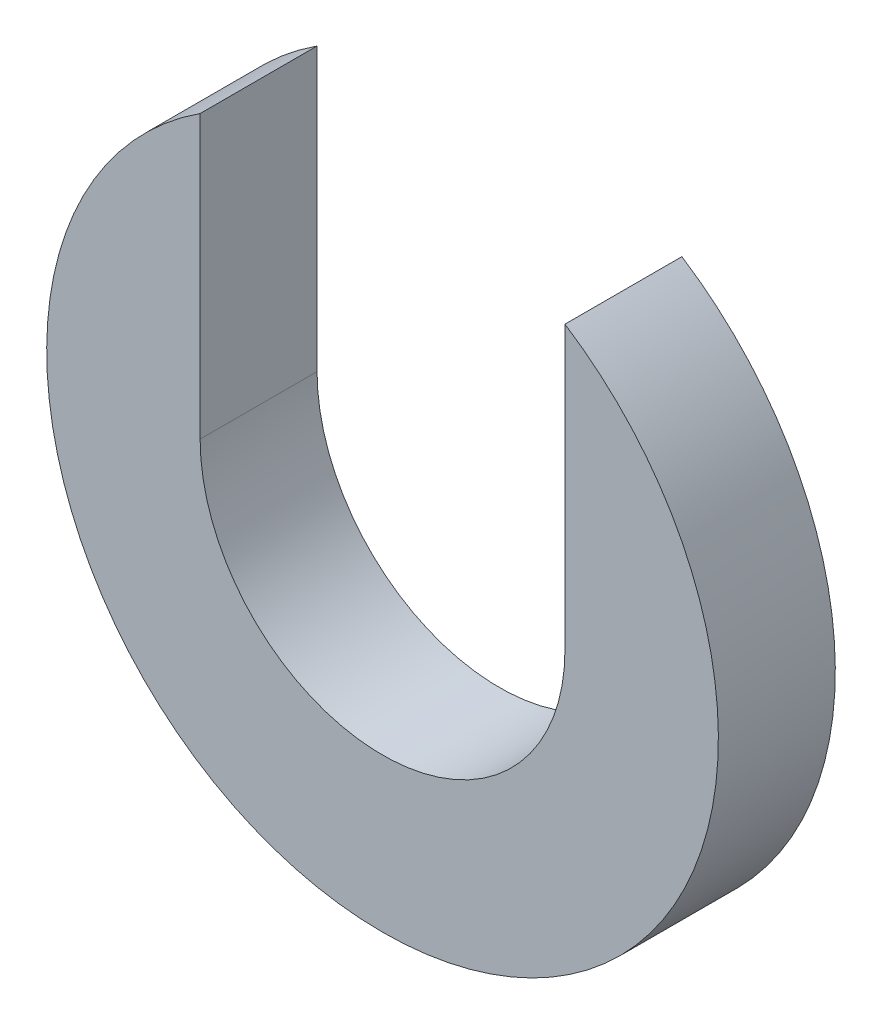
ISO-10303-21;
HEADER;
FILE_DESCRIPTION(('STEP AP214'),'2;1');
FILE_NAME('part.step','',(''),(''),'','','');
FILE_SCHEMA(('AUTOMOTIVE_DESIGN { 1 0 10303 214 1 1 1 1 }'));
ENDSEC;
DATA;
#1=APPLICATION_CONTEXT('core data for automotive mechanical design processes');
#2=APPLICATION_PROTOCOL_DEFINITION('international standard','automotive_design',2000,#1);
#3=PRODUCT_CONTEXT('',#1,'mechanical');
#4=PRODUCT('Part','Part','',(#3));
#5=PRODUCT_RELATED_PRODUCT_CATEGORY('part','',(#4));
#6=PRODUCT_DEFINITION_FORMATION('','',#4);
#7=PRODUCT_DEFINITION_CONTEXT('part definition',#1,'design');
#8=PRODUCT_DEFINITION('design','',#6,#7);
#9=PRODUCT_DEFINITION_SHAPE('','',#8);
#10=(LENGTH_UNIT() NAMED_UNIT(*) SI_UNIT(.MILLI.,.METRE.));
#11=(NAMED_UNIT(*) PLANE_ANGLE_UNIT() SI_UNIT($,.RADIAN.));
#12=(NAMED_UNIT(*) SI_UNIT($,.STERADIAN.) SOLID_ANGLE_UNIT());
#13=UNCERTAINTY_MEASURE_WITH_UNIT(LENGTH_MEASURE(1.E-05),#10,'distance_accuracy_value','');
#14=(GEOMETRIC_REPRESENTATION_CONTEXT(3) GLOBAL_UNCERTAINTY_ASSIGNED_CONTEXT((#13)) GLOBAL_UNIT_ASSIGNED_CONTEXT((#10,
#11,#12)) REPRESENTATION_CONTEXT('',''));
#15=CARTESIAN_POINT('',(0.,0.,0.));
#16=DIRECTION('',(0.,0.,1.));
#17=DIRECTION('',(1.,0.,0.));
#18=AXIS2_PLACEMENT_3D('',#15,#16,#17);
#19=CARTESIAN_POINT('',(0.,0.,3.175));
#20=DIRECTION('',(0.,0.,-1.));
#21=DIRECTION('',(-1.,0.,0.));
#22=AXIS2_PLACEMENT_3D('',#19,#20,#21);
#23=CYLINDRICAL_SURFACE('',#22,4.953);
#24=CARTESIAN_POINT('',(0.,0.,0.));
#25=DIRECTION('',(0.,0.,-1.));
#26=DIRECTION('',(1.,0.,0.));
#27=AXIS2_PLACEMENT_3D('',#24,#25,#26);
#28=CIRCLE('',#27,4.953);
#29=CARTESIAN_POINT('',(4.953,0.,0.));
#30=VERTEX_POINT('',#29);
#31=CARTESIAN_POINT('',(-4.953,0.,0.));
#32=VERTEX_POINT('',#31);
#33=EDGE_CURVE('E95',#30,#32,#28,.T.);
#34=ORIENTED_EDGE('',*,*,#33,.T.);
#35=DIRECTION('',(0.,0.,-1.));
#36=VECTOR('',#35,1.);
#37=CARTESIAN_POINT('',(-4.953,0.,3.175));
#38=LINE('',#37,#36);
#39=CARTESIAN_POINT('',(-4.953,0.,3.175));
#40=VERTEX_POINT('',#39);
#41=EDGE_CURVE('E11',#40,#32,#38,.T.);
#42=ORIENTED_EDGE('',*,*,#41,.F.);
#43=CARTESIAN_POINT('',(0.,0.,3.175));
#44=DIRECTION('',(0.,0.,-1.));
#45=DIRECTION('',(1.,0.,0.));
#46=AXIS2_PLACEMENT_3D('',#43,#44,#45);
#47=CIRCLE('',#46,4.953);
#48=CARTESIAN_POINT('',(4.953,0.,3.175));
#49=VERTEX_POINT('',#48);
#50=EDGE_CURVE('E83',#49,#40,#47,.T.);
#51=ORIENTED_EDGE('',*,*,#50,.F.);
#52=DIRECTION('',(0.,0.,-1.));
#53=VECTOR('',#52,1.);
#54=CARTESIAN_POINT('',(4.953,0.,3.175));
#55=LINE('',#54,#53);
#56=EDGE_CURVE('E91',#49,#30,#55,.T.);
#57=ORIENTED_EDGE('',*,*,#56,.T.);
#58=EDGE_LOOP('',(#34,#42,#51,#57));
#59=FACE_BOUND('',#58,.T.);
#60=ADVANCED_FACE('F32',(#59),#23,.F.);
#61=CARTESIAN_POINT('',(-4.953,0.,3.175));
#62=DIRECTION('',(-1.,0.,0.));
#63=DIRECTION('',(0.,0.,1.));
#64=AXIS2_PLACEMENT_3D('',#61,#62,#63);
#65=PLANE('',#64);
#66=DIRECTION('',(0.,1.,0.));
#67=VECTOR('',#66,1.);
#68=CARTESIAN_POINT('',(-4.953,0.,0.));
#69=LINE('',#68,#67);
#70=CARTESIAN_POINT('',(-4.953,7.65615157634696,0.));
#71=VERTEX_POINT('',#70);
#72=EDGE_CURVE('E87',#32,#71,#69,.T.);
#73=ORIENTED_EDGE('',*,*,#72,.T.);
#74=DIRECTION('',(0.,0.,-1.));
#75=VECTOR('',#74,1.);
#76=CARTESIAN_POINT('',(-4.953,7.65615157634696,3.175));
#77=LINE('',#76,#75);
#78=CARTESIAN_POINT('',(-4.953,7.65615157634696,3.175));
#79=VERTEX_POINT('',#78);
#80=EDGE_CURVE('E40',#79,#71,#77,.T.);
#81=ORIENTED_EDGE('',*,*,#80,.F.);
#82=DIRECTION('',(0.,1.,0.));
#83=VECTOR('',#82,1.);
#84=CARTESIAN_POINT('',(-4.953,0.,3.175));
#85=LINE('',#84,#83);
#86=EDGE_CURVE('E78',#40,#79,#85,.T.);
#87=ORIENTED_EDGE('',*,*,#86,.F.);
#88=ORIENTED_EDGE('',*,*,#41,.T.);
#89=EDGE_LOOP('',(#73,#81,#87,#88));
#90=FACE_BOUND('',#89,.T.);
#91=ADVANCED_FACE('F86',(#90),#65,.F.);
#92=CARTESIAN_POINT('',(0.,0.,3.175));
#93=DIRECTION('',(0.,0.,-1.));
#94=DIRECTION('',(-1.,0.,0.));
#95=AXIS2_PLACEMENT_3D('',#92,#93,#94);
#96=CYLINDRICAL_SURFACE('',#95,9.1186);
#97=CARTESIAN_POINT('',(0.,0.,0.));
#98=DIRECTION('',(0.,0.,1.));
#99=DIRECTION('',(1.,0.,0.));
#100=AXIS2_PLACEMENT_3D('',#97,#98,#99);
#101=CIRCLE('',#100,9.1186);
#102=CARTESIAN_POINT('',(4.953,7.65615157634696,0.));
#103=VERTEX_POINT('',#102);
#104=EDGE_CURVE('E65',#71,#103,#101,.T.);
#105=ORIENTED_EDGE('',*,*,#104,.T.);
#106=DIRECTION('',(0.,0.,-1.));
#107=VECTOR('',#106,1.);
#108=CARTESIAN_POINT('',(4.953,7.65615157634696,3.175));
#109=LINE('',#108,#107);
#110=CARTESIAN_POINT('',(4.953,7.65615157634696,3.175));
#111=VERTEX_POINT('',#110);
#112=EDGE_CURVE('E88',#111,#103,#109,.T.);
#113=ORIENTED_EDGE('',*,*,#112,.F.);
#114=CARTESIAN_POINT('',(0.,0.,3.175));
#115=DIRECTION('',(0.,0.,1.));
#116=DIRECTION('',(1.,0.,0.));
#117=AXIS2_PLACEMENT_3D('',#114,#115,#116);
#118=CIRCLE('',#117,9.1186);
#119=EDGE_CURVE('E81',#79,#111,#118,.T.);
#120=ORIENTED_EDGE('',*,*,#119,.F.);
#121=ORIENTED_EDGE('',*,*,#80,.T.);
#122=EDGE_LOOP('',(#105,#113,#120,#121));
#123=FACE_BOUND('',#122,.T.);
#124=ADVANCED_FACE('F89',(#123),#96,.T.);
#125=CARTESIAN_POINT('',(4.953,0.,3.175));
#126=DIRECTION('',(1.,0.,0.));
#127=DIRECTION('',(0.,0.,-1.));
#128=AXIS2_PLACEMENT_3D('',#125,#126,#127);
#129=PLANE('',#128);
#130=DIRECTION('',(0.,-1.,0.));
#131=VECTOR('',#130,1.);
#132=CARTESIAN_POINT('',(4.953,0.,0.));
#133=LINE('',#132,#131);
#134=EDGE_CURVE('E71',#103,#30,#133,.T.);
#135=ORIENTED_EDGE('',*,*,#134,.T.);
#136=ORIENTED_EDGE('',*,*,#56,.F.);
#137=DIRECTION('',(0.,-1.,0.));
#138=VECTOR('',#137,1.);
#139=CARTESIAN_POINT('',(4.953,0.,3.175));
#140=LINE('',#139,#138);
#141=EDGE_CURVE('E48',#111,#49,#140,.T.);
#142=ORIENTED_EDGE('',*,*,#141,.F.);
#143=ORIENTED_EDGE('',*,*,#112,.T.);
#144=EDGE_LOOP('',(#135,#136,#142,#143));
#145=FACE_BOUND('',#144,.T.);
#146=ADVANCED_FACE('F102',(#145),#129,.F.);
#147=CARTESIAN_POINT('',(0.,0.,3.175));
#148=DIRECTION('',(0.,0.,1.));
#149=DIRECTION('',(1.,0.,0.));
#150=AXIS2_PLACEMENT_3D('',#147,#148,#149);
#151=PLANE('',#150);
#152=ORIENTED_EDGE('',*,*,#50,.T.);
#153=ORIENTED_EDGE('',*,*,#86,.T.);
#154=ORIENTED_EDGE('',*,*,#119,.T.);
#155=ORIENTED_EDGE('',*,*,#141,.T.);
#156=EDGE_LOOP('',(#152,#153,#154,#155));
#157=FACE_BOUND('',#156,.T.);
#158=ADVANCED_FACE('F79',(#157),#151,.T.);
#159=CARTESIAN_POINT('',(0.,0.,0.));
#160=DIRECTION('',(0.,0.,1.));
#161=DIRECTION('',(1.,0.,0.));
#162=AXIS2_PLACEMENT_3D('',#159,#160,#161);
#163=PLANE('',#162);
#164=ORIENTED_EDGE('',*,*,#33,.F.);
#165=ORIENTED_EDGE('',*,*,#134,.F.);
#166=ORIENTED_EDGE('',*,*,#104,.F.);
#167=ORIENTED_EDGE('',*,*,#72,.F.);
#168=EDGE_LOOP('',(#164,#165,#166,#167));
#169=FACE_BOUND('',#168,.T.);
#170=ADVANCED_FACE('F105',(#169),#163,.F.);
#171=CLOSED_SHELL('',(#60,#91,#124,#146,#158,#170));
#172=MANIFOLD_SOLID_BREP('B2',#171);
#173=ADVANCED_BREP_SHAPE_REPRESENTATION('',(#18,#172),#14);
#174=SHAPE_DEFINITION_REPRESENTATION(#9,#173);
ENDSEC;
END-ISO-10303-21;
